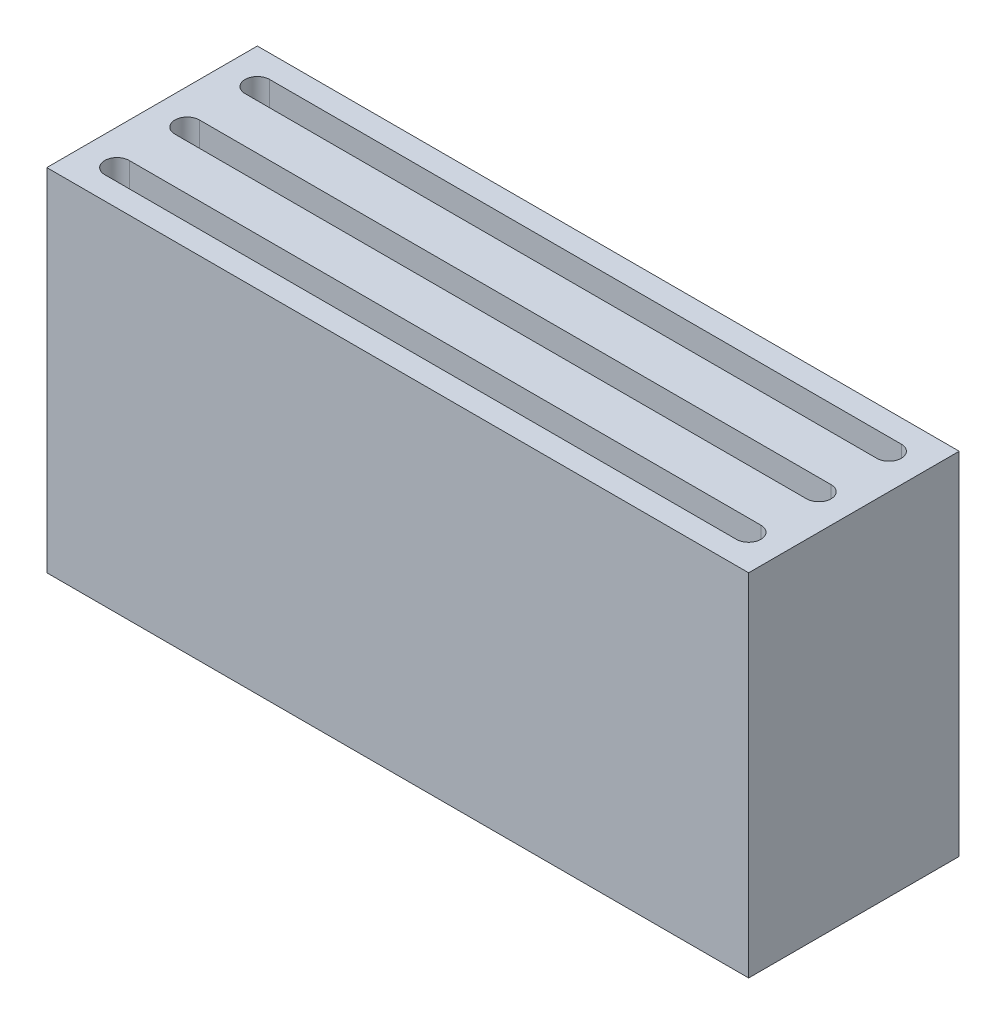
ISO-10303-21;
HEADER;
FILE_DESCRIPTION(('STEP AP214'),'2;1');
FILE_NAME('part.step','',(''),(''),'','','');
FILE_SCHEMA(('AUTOMOTIVE_DESIGN { 1 0 10303 214 1 1 1 1 }'));
ENDSEC;
DATA;
#1=APPLICATION_CONTEXT('core data for automotive mechanical design processes');
#2=APPLICATION_PROTOCOL_DEFINITION('international standard','automotive_design',2000,#1);
#3=PRODUCT_CONTEXT('',#1,'mechanical');
#4=PRODUCT('Part','Part','',(#3));
#5=PRODUCT_RELATED_PRODUCT_CATEGORY('part','',(#4));
#6=PRODUCT_DEFINITION_FORMATION('','',#4);
#7=PRODUCT_DEFINITION_CONTEXT('part definition',#1,'design');
#8=PRODUCT_DEFINITION('design','',#6,#7);
#9=PRODUCT_DEFINITION_SHAPE('','',#8);
#10=(LENGTH_UNIT() NAMED_UNIT(*) SI_UNIT(.MILLI.,.METRE.));
#11=(NAMED_UNIT(*) PLANE_ANGLE_UNIT() SI_UNIT($,.RADIAN.));
#12=(NAMED_UNIT(*) SI_UNIT($,.STERADIAN.) SOLID_ANGLE_UNIT());
#13=UNCERTAINTY_MEASURE_WITH_UNIT(LENGTH_MEASURE(1.E-05),#10,'distance_accuracy_value','');
#14=(GEOMETRIC_REPRESENTATION_CONTEXT(3) GLOBAL_UNCERTAINTY_ASSIGNED_CONTEXT((#13)) GLOBAL_UNIT_ASSIGNED_CONTEXT((#10,
#11,#12)) REPRESENTATION_CONTEXT('',''));
#15=CARTESIAN_POINT('',(0.,0.,0.));
#16=DIRECTION('',(0.,0.,1.));
#17=DIRECTION('',(1.,0.,0.));
#18=AXIS2_PLACEMENT_3D('',#15,#16,#17);
#19=CARTESIAN_POINT('',(5.,0.,-23.25));
#20=DIRECTION('',(0.,0.,1.));
#21=DIRECTION('',(1.,0.,0.));
#22=AXIS2_PLACEMENT_3D('',#19,#20,#21);
#23=PLANE('',#22);
#24=DIRECTION('',(1.,0.,0.));
#25=VECTOR('',#24,1.);
#26=CARTESIAN_POINT('',(5.,50.,-23.25));
#27=LINE('',#26,#25);
#28=CARTESIAN_POINT('',(5.,50.,-23.25));
#29=VERTEX_POINT('',#28);
#30=CARTESIAN_POINT('',(95.,50.,-23.25));
#31=VERTEX_POINT('',#30);
#32=EDGE_CURVE('E264',#29,#31,#27,.T.);
#33=ORIENTED_EDGE('',*,*,#32,.T.);
#34=DIRECTION('',(0.,1.,0.));
#35=VECTOR('',#34,1.);
#36=CARTESIAN_POINT('',(95.,0.,-23.25));
#37=LINE('',#36,#35);
#38=CARTESIAN_POINT('',(95.,0.,-23.25));
#39=VERTEX_POINT('',#38);
#40=EDGE_CURVE('E11',#39,#31,#37,.T.);
#41=ORIENTED_EDGE('',*,*,#40,.F.);
#42=DIRECTION('',(1.,0.,0.));
#43=VECTOR('',#42,1.);
#44=CARTESIAN_POINT('',(5.,0.,-23.25));
#45=LINE('',#44,#43);
#46=CARTESIAN_POINT('',(5.,0.,-23.25));
#47=VERTEX_POINT('',#46);
#48=EDGE_CURVE('E268',#47,#39,#45,.T.);
#49=ORIENTED_EDGE('',*,*,#48,.F.);
#50=DIRECTION('',(0.,1.,0.));
#51=VECTOR('',#50,1.);
#52=CARTESIAN_POINT('',(5.,0.,-23.25));
#53=LINE('',#52,#51);
#54=EDGE_CURVE('E273',#47,#29,#53,.T.);
#55=ORIENTED_EDGE('',*,*,#54,.T.);
#56=EDGE_LOOP('',(#33,#41,#49,#55));
#57=FACE_BOUND('',#56,.T.);
#58=ADVANCED_FACE('F39',(#57),#23,.F.);
#59=CARTESIAN_POINT('',(95.,0.,-25.));
#60=DIRECTION('',(0.,1.,0.));
#61=DIRECTION('',(0.,0.,1.));
#62=AXIS2_PLACEMENT_3D('',#59,#60,#61);
#63=CYLINDRICAL_SURFACE('',#62,1.75);
#64=CARTESIAN_POINT('',(95.,50.,-25.));
#65=DIRECTION('',(0.,1.,0.));
#66=DIRECTION('',(0.,0.,1.));
#67=AXIS2_PLACEMENT_3D('',#64,#65,#66);
#68=CIRCLE('',#67,1.75);
#69=CARTESIAN_POINT('',(95.,50.,-26.75));
#70=VERTEX_POINT('',#69);
#71=EDGE_CURVE('E261',#31,#70,#68,.T.);
#72=ORIENTED_EDGE('',*,*,#71,.T.);
#73=DIRECTION('',(0.,1.,0.));
#74=VECTOR('',#73,1.);
#75=CARTESIAN_POINT('',(95.,0.,-26.75));
#76=LINE('',#75,#74);
#77=CARTESIAN_POINT('',(95.,0.,-26.75));
#78=VERTEX_POINT('',#77);
#79=EDGE_CURVE('E46',#78,#70,#76,.T.);
#80=ORIENTED_EDGE('',*,*,#79,.F.);
#81=CARTESIAN_POINT('',(95.,0.,-25.));
#82=DIRECTION('',(0.,1.,0.));
#83=DIRECTION('',(0.,0.,1.));
#84=AXIS2_PLACEMENT_3D('',#81,#82,#83);
#85=CIRCLE('',#84,1.75);
#86=EDGE_CURVE('E60',#39,#78,#85,.T.);
#87=ORIENTED_EDGE('',*,*,#86,.F.);
#88=ORIENTED_EDGE('',*,*,#40,.T.);
#89=EDGE_LOOP('',(#72,#80,#87,#88));
#90=FACE_BOUND('',#89,.T.);
#91=ADVANCED_FACE('F283',(#90),#63,.F.);
#92=CARTESIAN_POINT('',(5.,0.,-26.75));
#93=DIRECTION('',(0.,0.,-1.));
#94=DIRECTION('',(-1.,0.,0.));
#95=AXIS2_PLACEMENT_3D('',#92,#93,#94);
#96=PLANE('',#95);
#97=DIRECTION('',(-1.,0.,0.));
#98=VECTOR('',#97,1.);
#99=CARTESIAN_POINT('',(5.,50.,-26.75));
#100=LINE('',#99,#98);
#101=CARTESIAN_POINT('',(5.,50.,-26.75));
#102=VERTEX_POINT('',#101);
#103=EDGE_CURVE('E258',#70,#102,#100,.T.);
#104=ORIENTED_EDGE('',*,*,#103,.T.);
#105=DIRECTION('',(0.,1.,0.));
#106=VECTOR('',#105,1.);
#107=CARTESIAN_POINT('',(5.,0.,-26.75));
#108=LINE('',#107,#106);
#109=CARTESIAN_POINT('',(5.,0.,-26.75));
#110=VERTEX_POINT('',#109);
#111=EDGE_CURVE('E276',#110,#102,#108,.T.);
#112=ORIENTED_EDGE('',*,*,#111,.F.);
#113=DIRECTION('',(-1.,0.,0.));
#114=VECTOR('',#113,1.);
#115=CARTESIAN_POINT('',(5.,0.,-26.75));
#116=LINE('',#115,#114);
#117=EDGE_CURVE('E271',#78,#110,#116,.T.);
#118=ORIENTED_EDGE('',*,*,#117,.F.);
#119=ORIENTED_EDGE('',*,*,#79,.T.);
#120=EDGE_LOOP('',(#104,#112,#118,#119));
#121=FACE_BOUND('',#120,.T.);
#122=ADVANCED_FACE('F280',(#121),#96,.F.);
#123=CARTESIAN_POINT('',(5.00000000000001,0.,-25.));
#124=DIRECTION('',(0.,1.,0.));
#125=DIRECTION('',(0.,0.,1.));
#126=AXIS2_PLACEMENT_3D('',#123,#124,#125);
#127=CYLINDRICAL_SURFACE('',#126,1.75);
#128=CARTESIAN_POINT('',(5.00000000000001,50.,-25.));
#129=DIRECTION('',(0.,1.,0.));
#130=DIRECTION('',(0.,0.,1.));
#131=AXIS2_PLACEMENT_3D('',#128,#129,#130);
#132=CIRCLE('',#131,1.75);
#133=EDGE_CURVE('E256',#102,#29,#132,.T.);
#134=ORIENTED_EDGE('',*,*,#133,.T.);
#135=ORIENTED_EDGE('',*,*,#54,.F.);
#136=CARTESIAN_POINT('',(5.00000000000001,0.,-25.));
#137=DIRECTION('',(0.,1.,0.));
#138=DIRECTION('',(0.,0.,1.));
#139=AXIS2_PLACEMENT_3D('',#136,#137,#138);
#140=CIRCLE('',#139,1.75);
#141=EDGE_CURVE('E53',#110,#47,#140,.T.);
#142=ORIENTED_EDGE('',*,*,#141,.F.);
#143=ORIENTED_EDGE('',*,*,#111,.T.);
#144=EDGE_LOOP('',(#134,#135,#142,#143));
#145=FACE_BOUND('',#144,.T.);
#146=ADVANCED_FACE('F289',(#145),#127,.F.);
#147=CARTESIAN_POINT('',(0.,50.,0.));
#148=DIRECTION('',(1.,0.,0.));
#149=DIRECTION('',(0.,0.,-1.));
#150=AXIS2_PLACEMENT_3D('',#147,#148,#149);
#151=PLANE('',#150);
#152=DIRECTION('',(0.,0.,1.));
#153=VECTOR('',#152,1.);
#154=CARTESIAN_POINT('',(0.,0.,0.));
#155=LINE('',#154,#153);
#156=CARTESIAN_POINT('',(0.,0.,-30.));
#157=VERTEX_POINT('',#156);
#158=CARTESIAN_POINT('',(0.,0.,0.));
#159=VERTEX_POINT('',#158);
#160=EDGE_CURVE('E220',#157,#159,#155,.T.);
#161=ORIENTED_EDGE('',*,*,#160,.T.);
#162=DIRECTION('',(0.,-1.,0.));
#163=VECTOR('',#162,1.);
#164=CARTESIAN_POINT('',(0.,50.,0.));
#165=LINE('',#164,#163);
#166=CARTESIAN_POINT('',(0.,50.,0.));
#167=VERTEX_POINT('',#166);
#168=EDGE_CURVE('E253',#167,#159,#165,.T.);
#169=ORIENTED_EDGE('',*,*,#168,.F.);
#170=DIRECTION('',(0.,0.,1.));
#171=VECTOR('',#170,1.);
#172=CARTESIAN_POINT('',(0.,50.,0.));
#173=LINE('',#172,#171);
#174=CARTESIAN_POINT('',(0.,50.,-30.));
#175=VERTEX_POINT('',#174);
#176=EDGE_CURVE('E227',#175,#167,#173,.T.);
#177=ORIENTED_EDGE('',*,*,#176,.F.);
#178=DIRECTION('',(0.,-1.,0.));
#179=VECTOR('',#178,1.);
#180=CARTESIAN_POINT('',(0.,50.,-30.));
#181=LINE('',#180,#179);
#182=EDGE_CURVE('E237',#175,#157,#181,.T.);
#183=ORIENTED_EDGE('',*,*,#182,.T.);
#184=EDGE_LOOP('',(#161,#169,#177,#183));
#185=FACE_BOUND('',#184,.T.);
#186=ADVANCED_FACE('F291',(#185),#151,.F.);
#187=CARTESIAN_POINT('',(0.,50.,0.));
#188=DIRECTION('',(0.,0.,-1.));
#189=DIRECTION('',(-1.,0.,0.));
#190=AXIS2_PLACEMENT_3D('',#187,#188,#189);
#191=PLANE('',#190);
#192=DIRECTION('',(1.,0.,0.));
#193=VECTOR('',#192,1.);
#194=CARTESIAN_POINT('',(0.,0.,0.));
#195=LINE('',#194,#193);
#196=CARTESIAN_POINT('',(100.,0.,0.));
#197=VERTEX_POINT('',#196);
#198=EDGE_CURVE('E240',#159,#197,#195,.T.);
#199=ORIENTED_EDGE('',*,*,#198,.T.);
#200=DIRECTION('',(0.,-1.,0.));
#201=VECTOR('',#200,1.);
#202=CARTESIAN_POINT('',(100.,50.,0.));
#203=LINE('',#202,#201);
#204=CARTESIAN_POINT('',(100.,50.,0.));
#205=VERTEX_POINT('',#204);
#206=EDGE_CURVE('E250',#205,#197,#203,.T.);
#207=ORIENTED_EDGE('',*,*,#206,.F.);
#208=DIRECTION('',(1.,0.,0.));
#209=VECTOR('',#208,1.);
#210=CARTESIAN_POINT('',(0.,50.,0.));
#211=LINE('',#210,#209);
#212=EDGE_CURVE('E230',#167,#205,#211,.T.);
#213=ORIENTED_EDGE('',*,*,#212,.F.);
#214=ORIENTED_EDGE('',*,*,#168,.T.);
#215=EDGE_LOOP('',(#199,#207,#213,#214));
#216=FACE_BOUND('',#215,.T.);
#217=ADVANCED_FACE('F297',(#216),#191,.F.);
#218=CARTESIAN_POINT('',(100.,50.,0.));
#219=DIRECTION('',(-1.,0.,0.));
#220=DIRECTION('',(0.,0.,1.));
#221=AXIS2_PLACEMENT_3D('',#218,#219,#220);
#222=PLANE('',#221);
#223=DIRECTION('',(0.,0.,-1.));
#224=VECTOR('',#223,1.);
#225=CARTESIAN_POINT('',(100.,0.,0.));
#226=LINE('',#225,#224);
#227=CARTESIAN_POINT('',(100.,0.,-30.));
#228=VERTEX_POINT('',#227);
#229=EDGE_CURVE('E242',#197,#228,#226,.T.);
#230=ORIENTED_EDGE('',*,*,#229,.T.);
#231=DIRECTION('',(0.,-1.,0.));
#232=VECTOR('',#231,1.);
#233=CARTESIAN_POINT('',(100.,50.,-30.));
#234=LINE('',#233,#232);
#235=CARTESIAN_POINT('',(100.,50.,-30.));
#236=VERTEX_POINT('',#235);
#237=EDGE_CURVE('E247',#236,#228,#234,.T.);
#238=ORIENTED_EDGE('',*,*,#237,.F.);
#239=DIRECTION('',(0.,0.,-1.));
#240=VECTOR('',#239,1.);
#241=CARTESIAN_POINT('',(100.,50.,0.));
#242=LINE('',#241,#240);
#243=EDGE_CURVE('E233',#205,#236,#242,.T.);
#244=ORIENTED_EDGE('',*,*,#243,.F.);
#245=ORIENTED_EDGE('',*,*,#206,.T.);
#246=EDGE_LOOP('',(#230,#238,#244,#245));
#247=FACE_BOUND('',#246,.T.);
#248=ADVANCED_FACE('F446',(#247),#222,.F.);
#249=CARTESIAN_POINT('',(0.,50.,-30.));
#250=DIRECTION('',(0.,0.,1.));
#251=DIRECTION('',(1.,0.,0.));
#252=AXIS2_PLACEMENT_3D('',#249,#250,#251);
#253=PLANE('',#252);
#254=DIRECTION('',(-1.,0.,0.));
#255=VECTOR('',#254,1.);
#256=CARTESIAN_POINT('',(0.,0.,-30.));
#257=LINE('',#256,#255);
#258=EDGE_CURVE('E231',#228,#157,#257,.T.);
#259=ORIENTED_EDGE('',*,*,#258,.T.);
#260=ORIENTED_EDGE('',*,*,#182,.F.);
#261=DIRECTION('',(-1.,0.,0.));
#262=VECTOR('',#261,1.);
#263=CARTESIAN_POINT('',(0.,50.,-30.));
#264=LINE('',#263,#262);
#265=EDGE_CURVE('E235',#236,#175,#264,.T.);
#266=ORIENTED_EDGE('',*,*,#265,.F.);
#267=ORIENTED_EDGE('',*,*,#237,.T.);
#268=EDGE_LOOP('',(#259,#260,#266,#267));
#269=FACE_BOUND('',#268,.T.);
#270=ADVANCED_FACE('F328',(#269),#253,.F.);
#271=CARTESIAN_POINT('',(0.,50.,0.));
#272=DIRECTION('',(0.,-1.,0.));
#273=DIRECTION('',(0.,0.,-1.));
#274=AXIS2_PLACEMENT_3D('',#271,#272,#273);
#275=PLANE('',#274);
#276=DIRECTION('',(1.,0.,0.));
#277=VECTOR('',#276,1.);
#278=CARTESIAN_POINT('',(5.,50.,-13.25));
#279=LINE('',#278,#277);
#280=CARTESIAN_POINT('',(5.,50.,-13.25));
#281=VERTEX_POINT('',#280);
#282=CARTESIAN_POINT('',(95.,50.,-13.25));
#283=VERTEX_POINT('',#282);
#284=EDGE_CURVE('E153',#281,#283,#279,.T.);
#285=ORIENTED_EDGE('',*,*,#284,.F.);
#286=CARTESIAN_POINT('',(5.00000000000001,50.,-15.));
#287=DIRECTION('',(0.,1.,0.));
#288=DIRECTION('',(0.,0.,1.));
#289=AXIS2_PLACEMENT_3D('',#286,#287,#288);
#290=CIRCLE('',#289,1.75);
#291=CARTESIAN_POINT('',(5.,50.,-16.75));
#292=VERTEX_POINT('',#291);
#293=EDGE_CURVE('E189',#292,#281,#290,.T.);
#294=ORIENTED_EDGE('',*,*,#293,.F.);
#295=DIRECTION('',(-1.,0.,0.));
#296=VECTOR('',#295,1.);
#297=CARTESIAN_POINT('',(5.,50.,-16.75));
#298=LINE('',#297,#296);
#299=CARTESIAN_POINT('',(95.,50.,-16.75));
#300=VERTEX_POINT('',#299);
#301=EDGE_CURVE('E175',#300,#292,#298,.T.);
#302=ORIENTED_EDGE('',*,*,#301,.F.);
#303=CARTESIAN_POINT('',(95.,50.,-15.));
#304=DIRECTION('',(0.,1.,0.));
#305=DIRECTION('',(0.,0.,1.));
#306=AXIS2_PLACEMENT_3D('',#303,#304,#305);
#307=CIRCLE('',#306,1.75);
#308=EDGE_CURVE('E167',#283,#300,#307,.T.);
#309=ORIENTED_EDGE('',*,*,#308,.F.);
#310=EDGE_LOOP('',(#285,#294,#302,#309));
#311=FACE_BOUND('',#310,.T.);
#312=DIRECTION('',(1.,0.,0.));
#313=VECTOR('',#312,1.);
#314=CARTESIAN_POINT('',(5.,50.,-3.25));
#315=LINE('',#314,#313);
#316=CARTESIAN_POINT('',(5.,50.,-3.25));
#317=VERTEX_POINT('',#316);
#318=CARTESIAN_POINT('',(95.,50.,-3.25));
#319=VERTEX_POINT('',#318);
#320=EDGE_CURVE('E210',#317,#319,#315,.T.);
#321=ORIENTED_EDGE('',*,*,#320,.F.);
#322=CARTESIAN_POINT('',(5.00000000000001,50.,-5.));
#323=DIRECTION('',(0.,1.,0.));
#324=DIRECTION('',(0.,0.,1.));
#325=AXIS2_PLACEMENT_3D('',#322,#323,#324);
#326=CIRCLE('',#325,1.75);
#327=CARTESIAN_POINT('',(5.,50.,-6.75));
#328=VERTEX_POINT('',#327);
#329=EDGE_CURVE('E194',#328,#317,#326,.T.);
#330=ORIENTED_EDGE('',*,*,#329,.F.);
#331=DIRECTION('',(-1.,0.,0.));
#332=VECTOR('',#331,1.);
#333=CARTESIAN_POINT('',(5.,50.,-6.75));
#334=LINE('',#333,#332);
#335=CARTESIAN_POINT('',(95.,50.,-6.75));
#336=VERTEX_POINT('',#335);
#337=EDGE_CURVE('E199',#336,#328,#334,.T.);
#338=ORIENTED_EDGE('',*,*,#337,.F.);
#339=CARTESIAN_POINT('',(95.,50.,-5.));
#340=DIRECTION('',(0.,1.,0.));
#341=DIRECTION('',(0.,0.,1.));
#342=AXIS2_PLACEMENT_3D('',#339,#340,#341);
#343=CIRCLE('',#342,1.75);
#344=EDGE_CURVE('E213',#319,#336,#343,.T.);
#345=ORIENTED_EDGE('',*,*,#344,.F.);
#346=EDGE_LOOP('',(#321,#330,#338,#345));
#347=FACE_BOUND('',#346,.T.);
#348=ORIENTED_EDGE('',*,*,#176,.T.);
#349=ORIENTED_EDGE('',*,*,#212,.T.);
#350=ORIENTED_EDGE('',*,*,#243,.T.);
#351=ORIENTED_EDGE('',*,*,#265,.T.);
#352=EDGE_LOOP('',(#348,#349,#350,#351));
#353=FACE_BOUND('',#352,.T.);
#354=ORIENTED_EDGE('',*,*,#133,.F.);
#355=ORIENTED_EDGE('',*,*,#103,.F.);
#356=ORIENTED_EDGE('',*,*,#71,.F.);
#357=ORIENTED_EDGE('',*,*,#32,.F.);
#358=EDGE_LOOP('',(#354,#355,#356,#357));
#359=FACE_BOUND('',#358,.T.);
#360=ADVANCED_FACE('F173',(#311,#347,#353,#359),#275,.F.);
#361=CARTESIAN_POINT('',(0.,0.,0.));
#362=DIRECTION('',(0.,-1.,0.));
#363=DIRECTION('',(0.,0.,-1.));
#364=AXIS2_PLACEMENT_3D('',#361,#362,#363);
#365=PLANE('',#364);
#366=CARTESIAN_POINT('',(5.00000000000001,0.,-15.));
#367=DIRECTION('',(0.,1.,0.));
#368=DIRECTION('',(0.,0.,1.));
#369=AXIS2_PLACEMENT_3D('',#366,#367,#368);
#370=CIRCLE('',#369,1.75);
#371=CARTESIAN_POINT('',(5.,0.,-16.75));
#372=VERTEX_POINT('',#371);
#373=CARTESIAN_POINT('',(5.,0.,-13.25));
#374=VERTEX_POINT('',#373);
#375=EDGE_CURVE('E191',#372,#374,#370,.T.);
#376=ORIENTED_EDGE('',*,*,#375,.T.);
#377=DIRECTION('',(1.,0.,0.));
#378=VECTOR('',#377,1.);
#379=CARTESIAN_POINT('',(5.,0.,-13.25));
#380=LINE('',#379,#378);
#381=CARTESIAN_POINT('',(95.,0.,-13.25));
#382=VERTEX_POINT('',#381);
#383=EDGE_CURVE('E163',#374,#382,#380,.T.);
#384=ORIENTED_EDGE('',*,*,#383,.T.);
#385=CARTESIAN_POINT('',(95.,0.,-15.));
#386=DIRECTION('',(0.,1.,0.));
#387=DIRECTION('',(0.,0.,1.));
#388=AXIS2_PLACEMENT_3D('',#385,#386,#387);
#389=CIRCLE('',#388,1.75);
#390=CARTESIAN_POINT('',(95.,0.,-16.75));
#391=VERTEX_POINT('',#390);
#392=EDGE_CURVE('E170',#382,#391,#389,.T.);
#393=ORIENTED_EDGE('',*,*,#392,.T.);
#394=DIRECTION('',(-1.,0.,0.));
#395=VECTOR('',#394,1.);
#396=CARTESIAN_POINT('',(5.,0.,-16.75));
#397=LINE('',#396,#395);
#398=EDGE_CURVE('E186',#391,#372,#397,.T.);
#399=ORIENTED_EDGE('',*,*,#398,.T.);
#400=EDGE_LOOP('',(#376,#384,#393,#399));
#401=FACE_BOUND('',#400,.T.);
#402=CARTESIAN_POINT('',(5.00000000000001,0.,-5.));
#403=DIRECTION('',(0.,1.,0.));
#404=DIRECTION('',(0.,0.,1.));
#405=AXIS2_PLACEMENT_3D('',#402,#403,#404);
#406=CIRCLE('',#405,1.75);
#407=CARTESIAN_POINT('',(5.,0.,-6.75));
#408=VERTEX_POINT('',#407);
#409=CARTESIAN_POINT('',(5.,0.,-3.25));
#410=VERTEX_POINT('',#409);
#411=EDGE_CURVE('E195',#408,#410,#406,.T.);
#412=ORIENTED_EDGE('',*,*,#411,.T.);
#413=DIRECTION('',(1.,0.,0.));
#414=VECTOR('',#413,1.);
#415=CARTESIAN_POINT('',(5.,0.,-3.25));
#416=LINE('',#415,#414);
#417=CARTESIAN_POINT('',(95.,0.,-3.25));
#418=VERTEX_POINT('',#417);
#419=EDGE_CURVE('E198',#410,#418,#416,.T.);
#420=ORIENTED_EDGE('',*,*,#419,.T.);
#421=CARTESIAN_POINT('',(95.,0.,-5.));
#422=DIRECTION('',(0.,1.,0.));
#423=DIRECTION('',(0.,0.,1.));
#424=AXIS2_PLACEMENT_3D('',#421,#422,#423);
#425=CIRCLE('',#424,1.75);
#426=CARTESIAN_POINT('',(95.,0.,-6.75));
#427=VERTEX_POINT('',#426);
#428=EDGE_CURVE('E202',#418,#427,#425,.T.);
#429=ORIENTED_EDGE('',*,*,#428,.T.);
#430=DIRECTION('',(-1.,0.,0.));
#431=VECTOR('',#430,1.);
#432=CARTESIAN_POINT('',(5.,0.,-6.75));
#433=LINE('',#432,#431);
#434=EDGE_CURVE('E205',#427,#408,#433,.T.);
#435=ORIENTED_EDGE('',*,*,#434,.T.);
#436=EDGE_LOOP('',(#412,#420,#429,#435));
#437=FACE_BOUND('',#436,.T.);
#438=ORIENTED_EDGE('',*,*,#160,.F.);
#439=ORIENTED_EDGE('',*,*,#258,.F.);
#440=ORIENTED_EDGE('',*,*,#229,.F.);
#441=ORIENTED_EDGE('',*,*,#198,.F.);
#442=EDGE_LOOP('',(#438,#439,#440,#441));
#443=FACE_BOUND('',#442,.T.);
#444=ORIENTED_EDGE('',*,*,#141,.T.);
#445=ORIENTED_EDGE('',*,*,#48,.T.);
#446=ORIENTED_EDGE('',*,*,#86,.T.);
#447=ORIENTED_EDGE('',*,*,#117,.T.);
#448=EDGE_LOOP('',(#444,#445,#446,#447));
#449=FACE_BOUND('',#448,.T.);
#450=ADVANCED_FACE('F327',(#401,#437,#443,#449),#365,.T.);
#451=CARTESIAN_POINT('',(5.00000000000001,0.,-5.));
#452=DIRECTION('',(0.,1.,0.));
#453=DIRECTION('',(0.,0.,1.));
#454=AXIS2_PLACEMENT_3D('',#451,#452,#453);
#455=CYLINDRICAL_SURFACE('',#454,1.75);
#456=ORIENTED_EDGE('',*,*,#329,.T.);
#457=DIRECTION('',(0.,1.,0.));
#458=VECTOR('',#457,1.);
#459=CARTESIAN_POINT('',(5.,0.,-3.25));
#460=LINE('',#459,#458);
#461=EDGE_CURVE('E208',#410,#317,#460,.T.);
#462=ORIENTED_EDGE('',*,*,#461,.F.);
#463=ORIENTED_EDGE('',*,*,#411,.F.);
#464=DIRECTION('',(0.,1.,0.));
#465=VECTOR('',#464,1.);
#466=CARTESIAN_POINT('',(5.,0.,-6.75));
#467=LINE('',#466,#465);
#468=EDGE_CURVE('E218',#408,#328,#467,.T.);
#469=ORIENTED_EDGE('',*,*,#468,.T.);
#470=EDGE_LOOP('',(#456,#462,#463,#469));
#471=FACE_BOUND('',#470,.T.);
#472=ADVANCED_FACE('F340',(#471),#455,.F.);
#473=CARTESIAN_POINT('',(5.,0.,-6.75));
#474=DIRECTION('',(0.,0.,-1.));
#475=DIRECTION('',(-1.,0.,0.));
#476=AXIS2_PLACEMENT_3D('',#473,#474,#475);
#477=PLANE('',#476);
#478=ORIENTED_EDGE('',*,*,#337,.T.);
#479=ORIENTED_EDGE('',*,*,#468,.F.);
#480=ORIENTED_EDGE('',*,*,#434,.F.);
#481=DIRECTION('',(0.,1.,0.));
#482=VECTOR('',#481,1.);
#483=CARTESIAN_POINT('',(95.,0.,-6.75));
#484=LINE('',#483,#482);
#485=EDGE_CURVE('E221',#427,#336,#484,.T.);
#486=ORIENTED_EDGE('',*,*,#485,.T.);
#487=EDGE_LOOP('',(#478,#479,#480,#486));
#488=FACE_BOUND('',#487,.T.);
#489=ADVANCED_FACE('F420',(#488),#477,.F.);
#490=CARTESIAN_POINT('',(95.,0.,-5.));
#491=DIRECTION('',(0.,1.,0.));
#492=DIRECTION('',(0.,0.,1.));
#493=AXIS2_PLACEMENT_3D('',#490,#491,#492);
#494=CYLINDRICAL_SURFACE('',#493,1.75);
#495=ORIENTED_EDGE('',*,*,#344,.T.);
#496=ORIENTED_EDGE('',*,*,#485,.F.);
#497=ORIENTED_EDGE('',*,*,#428,.F.);
#498=DIRECTION('',(0.,1.,0.));
#499=VECTOR('',#498,1.);
#500=CARTESIAN_POINT('',(95.,0.,-3.25));
#501=LINE('',#500,#499);
#502=EDGE_CURVE('E223',#418,#319,#501,.T.);
#503=ORIENTED_EDGE('',*,*,#502,.T.);
#504=EDGE_LOOP('',(#495,#496,#497,#503));
#505=FACE_BOUND('',#504,.T.);
#506=ADVANCED_FACE('F409',(#505),#494,.F.);
#507=CARTESIAN_POINT('',(5.,0.,-3.25));
#508=DIRECTION('',(0.,0.,1.));
#509=DIRECTION('',(1.,0.,0.));
#510=AXIS2_PLACEMENT_3D('',#507,#508,#509);
#511=PLANE('',#510);
#512=ORIENTED_EDGE('',*,*,#320,.T.);
#513=ORIENTED_EDGE('',*,*,#502,.F.);
#514=ORIENTED_EDGE('',*,*,#419,.F.);
#515=ORIENTED_EDGE('',*,*,#461,.T.);
#516=EDGE_LOOP('',(#512,#513,#514,#515));
#517=FACE_BOUND('',#516,.T.);
#518=ADVANCED_FACE('F354',(#517),#511,.F.);
#519=CARTESIAN_POINT('',(5.00000000000001,0.,-15.));
#520=DIRECTION('',(0.,1.,0.));
#521=DIRECTION('',(0.,0.,1.));
#522=AXIS2_PLACEMENT_3D('',#519,#520,#521);
#523=CYLINDRICAL_SURFACE('',#522,1.75);
#524=ORIENTED_EDGE('',*,*,#293,.T.);
#525=DIRECTION('',(0.,1.,0.));
#526=VECTOR('',#525,1.);
#527=CARTESIAN_POINT('',(5.,0.,-13.25));
#528=LINE('',#527,#526);
#529=EDGE_CURVE('E159',#374,#281,#528,.T.);
#530=ORIENTED_EDGE('',*,*,#529,.F.);
#531=ORIENTED_EDGE('',*,*,#375,.F.);
#532=DIRECTION('',(0.,1.,0.));
#533=VECTOR('',#532,1.);
#534=CARTESIAN_POINT('',(5.,0.,-16.75));
#535=LINE('',#534,#533);
#536=EDGE_CURVE('E183',#372,#292,#535,.T.);
#537=ORIENTED_EDGE('',*,*,#536,.T.);
#538=EDGE_LOOP('',(#524,#530,#531,#537));
#539=FACE_BOUND('',#538,.T.);
#540=ADVANCED_FACE('F349',(#539),#523,.F.);
#541=CARTESIAN_POINT('',(5.,0.,-16.75));
#542=DIRECTION('',(0.,0.,-1.));
#543=DIRECTION('',(-1.,0.,0.));
#544=AXIS2_PLACEMENT_3D('',#541,#542,#543);
#545=PLANE('',#544);
#546=ORIENTED_EDGE('',*,*,#301,.T.);
#547=ORIENTED_EDGE('',*,*,#536,.F.);
#548=ORIENTED_EDGE('',*,*,#398,.F.);
#549=DIRECTION('',(0.,1.,0.));
#550=VECTOR('',#549,1.);
#551=CARTESIAN_POINT('',(95.,0.,-16.75));
#552=LINE('',#551,#550);
#553=EDGE_CURVE('E176',#391,#300,#552,.T.);
#554=ORIENTED_EDGE('',*,*,#553,.T.);
#555=EDGE_LOOP('',(#546,#547,#548,#554));
#556=FACE_BOUND('',#555,.T.);
#557=ADVANCED_FACE('F353',(#556),#545,.F.);
#558=CARTESIAN_POINT('',(95.,0.,-15.));
#559=DIRECTION('',(0.,1.,0.));
#560=DIRECTION('',(0.,0.,1.));
#561=AXIS2_PLACEMENT_3D('',#558,#559,#560);
#562=CYLINDRICAL_SURFACE('',#561,1.75);
#563=ORIENTED_EDGE('',*,*,#308,.T.);
#564=ORIENTED_EDGE('',*,*,#553,.F.);
#565=ORIENTED_EDGE('',*,*,#392,.F.);
#566=DIRECTION('',(0.,1.,0.));
#567=VECTOR('',#566,1.);
#568=CARTESIAN_POINT('',(95.,0.,-13.25));
#569=LINE('',#568,#567);
#570=EDGE_CURVE('E156',#382,#283,#569,.T.);
#571=ORIENTED_EDGE('',*,*,#570,.T.);
#572=EDGE_LOOP('',(#563,#564,#565,#571));
#573=FACE_BOUND('',#572,.T.);
#574=ADVANCED_FACE('F166',(#573),#562,.F.);
#575=CARTESIAN_POINT('',(5.,0.,-13.25));
#576=DIRECTION('',(0.,0.,1.));
#577=DIRECTION('',(1.,0.,0.));
#578=AXIS2_PLACEMENT_3D('',#575,#576,#577);
#579=PLANE('',#578);
#580=ORIENTED_EDGE('',*,*,#284,.T.);
#581=ORIENTED_EDGE('',*,*,#570,.F.);
#582=ORIENTED_EDGE('',*,*,#383,.F.);
#583=ORIENTED_EDGE('',*,*,#529,.T.);
#584=EDGE_LOOP('',(#580,#581,#582,#583));
#585=FACE_BOUND('',#584,.T.);
#586=ADVANCED_FACE('F155',(#585),#579,.F.);
#587=CLOSED_SHELL('',(#58,#91,#122,#146,#186,#217,#248,#270,#360,#450,#472,#489,#506,#518,#540,
#557,#574,#586));
#588=MANIFOLD_SOLID_BREP('B2',#587);
#589=ADVANCED_BREP_SHAPE_REPRESENTATION('',(#18,#588),#14);
#590=SHAPE_DEFINITION_REPRESENTATION(#9,#589);
ENDSEC;
END-ISO-10303-21;
